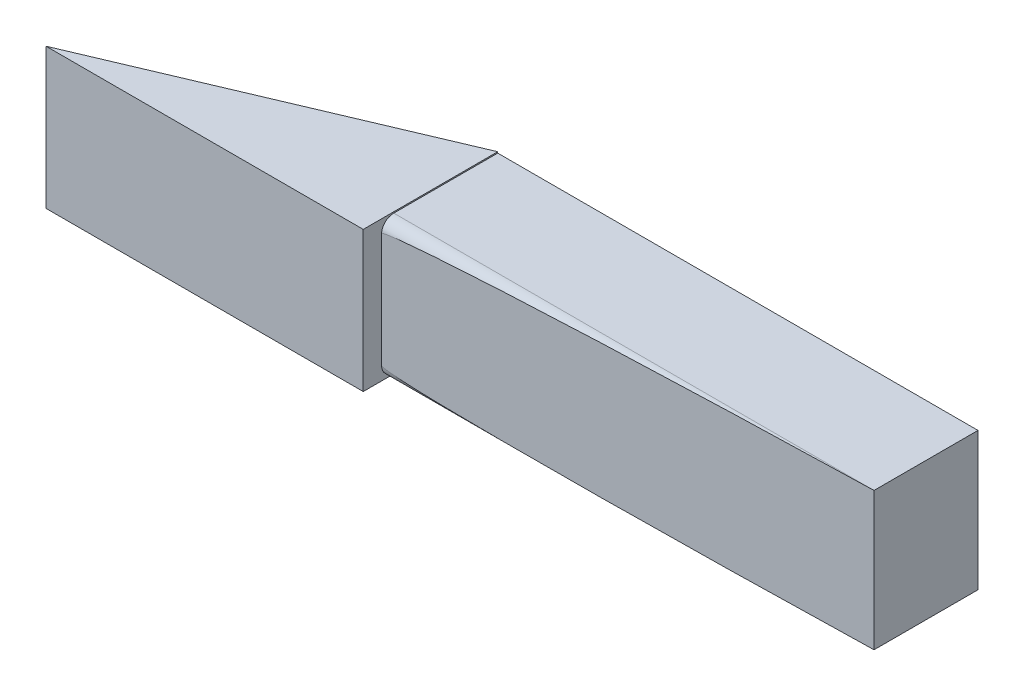
ISO-10303-21;
HEADER;
FILE_DESCRIPTION(('STEP AP214'),'2;1');
FILE_NAME('part.step','',(''),(''),'','','');
FILE_SCHEMA(('AUTOMOTIVE_DESIGN { 1 0 10303 214 1 1 1 1 }'));
ENDSEC;
DATA;
#1=APPLICATION_CONTEXT('core data for automotive mechanical design processes');
#2=APPLICATION_PROTOCOL_DEFINITION('international standard','automotive_design',2000,#1);
#3=PRODUCT_CONTEXT('',#1,'mechanical');
#4=PRODUCT('Part','Part','',(#3));
#5=PRODUCT_RELATED_PRODUCT_CATEGORY('part','',(#4));
#6=PRODUCT_DEFINITION_FORMATION('','',#4);
#7=PRODUCT_DEFINITION_CONTEXT('part definition',#1,'design');
#8=PRODUCT_DEFINITION('design','',#6,#7);
#9=PRODUCT_DEFINITION_SHAPE('','',#8);
#10=(LENGTH_UNIT() NAMED_UNIT(*) SI_UNIT(.MILLI.,.METRE.));
#11=(NAMED_UNIT(*) PLANE_ANGLE_UNIT() SI_UNIT($,.RADIAN.));
#12=(NAMED_UNIT(*) SI_UNIT($,.STERADIAN.) SOLID_ANGLE_UNIT());
#13=UNCERTAINTY_MEASURE_WITH_UNIT(LENGTH_MEASURE(1.E-05),#10,'distance_accuracy_value','');
#14=(GEOMETRIC_REPRESENTATION_CONTEXT(3) GLOBAL_UNCERTAINTY_ASSIGNED_CONTEXT((#13)) GLOBAL_UNIT_ASSIGNED_CONTEXT((#10,
#11,#12)) REPRESENTATION_CONTEXT('',''));
#15=CARTESIAN_POINT('',(0.,0.,0.));
#16=DIRECTION('',(0.,0.,1.));
#17=DIRECTION('',(1.,0.,0.));
#18=AXIS2_PLACEMENT_3D('',#15,#16,#17);
#19=CARTESIAN_POINT('',(-157.293506651165,-23.,114.887808394791));
#20=DIRECTION('',(0.,0.,-1.));
#21=DIRECTION('',(-1.,0.,0.));
#22=AXIS2_PLACEMENT_3D('',#19,#20,#21);
#23=PLANE('',#22);
#24=DIRECTION('',(0.,1.,0.));
#25=VECTOR('',#24,1.);
#26=CARTESIAN_POINT('',(-78.6662981451881,-23.,114.887808394791));
#27=LINE('',#26,#25);
#28=CARTESIAN_POINT('',(-78.6662981451881,-22.8,114.887808394791));
#29=VERTEX_POINT('',#28);
#30=CARTESIAN_POINT('',(-78.6662981451881,-0.2,114.887808394791));
#31=VERTEX_POINT('',#30);
#32=EDGE_CURVE('E141',#29,#31,#27,.T.);
#33=ORIENTED_EDGE('',*,*,#32,.F.);
#34=DIRECTION('',(-1.,0.,0.));
#35=VECTOR('',#34,1.);
#36=CARTESIAN_POINT('',(-157.293506651165,-22.8,114.887808394791));
#37=LINE('',#36,#35);
#38=CARTESIAN_POINT('',(-157.293506651165,-22.8,114.887808394791));
#39=VERTEX_POINT('',#38);
#40=EDGE_CURVE('E179',#29,#39,#37,.T.);
#41=ORIENTED_EDGE('',*,*,#40,.T.);
#42=DIRECTION('',(0.,1.,0.));
#43=VECTOR('',#42,1.);
#44=CARTESIAN_POINT('',(-157.293506651165,-23.,114.887808394791));
#45=LINE('',#44,#43);
#46=CARTESIAN_POINT('',(-157.293506651165,-0.2,114.887808394791));
#47=VERTEX_POINT('',#46);
#48=EDGE_CURVE('E140',#39,#47,#45,.T.);
#49=ORIENTED_EDGE('',*,*,#48,.T.);
#50=DIRECTION('',(1.,0.,0.));
#51=VECTOR('',#50,1.);
#52=CARTESIAN_POINT('',(-157.293506651165,-0.199999999999999,114.887808394791));
#53=LINE('',#52,#51);
#54=EDGE_CURVE('E371',#47,#31,#53,.T.);
#55=ORIENTED_EDGE('',*,*,#54,.T.);
#56=EDGE_LOOP('',(#33,#41,#49,#55));
#57=FACE_BOUND('',#56,.T.);
#58=ADVANCED_FACE('F71',(#57),#23,.T.);
#59=CARTESIAN_POINT('',(-78.6662981451881,-23.,114.887808394791));
#60=DIRECTION('',(1.,0.,0.));
#61=DIRECTION('',(0.,0.,-1.));
#62=AXIS2_PLACEMENT_3D('',#59,#60,#61);
#63=PLANE('',#62);
#64=DIRECTION('',(0.,1.,0.));
#65=VECTOR('',#64,1.);
#66=CARTESIAN_POINT('',(-78.6662981451881,-23.,131.906813660593));
#67=LINE('',#66,#65);
#68=CARTESIAN_POINT('',(-78.6662981451881,-22.8,131.906813660593));
#69=VERTEX_POINT('',#68);
#70=CARTESIAN_POINT('',(-78.6662981451881,-0.2,131.906813660593));
#71=VERTEX_POINT('',#70);
#72=EDGE_CURVE('E144',#69,#71,#67,.T.);
#73=ORIENTED_EDGE('',*,*,#72,.F.);
#74=DIRECTION('',(0.,0.,-1.));
#75=VECTOR('',#74,1.);
#76=CARTESIAN_POINT('',(-78.6662981451881,-22.8,131.906813660593));
#77=LINE('',#76,#75);
#78=EDGE_CURVE('E352',#69,#29,#77,.T.);
#79=ORIENTED_EDGE('',*,*,#78,.T.);
#80=ORIENTED_EDGE('',*,*,#32,.T.);
#81=DIRECTION('',(0.,0.,1.));
#82=VECTOR('',#81,1.);
#83=CARTESIAN_POINT('',(-78.6662981451881,-0.2,114.246438840142));
#84=LINE('',#83,#82);
#85=EDGE_CURVE('E362',#31,#71,#84,.T.);
#86=ORIENTED_EDGE('',*,*,#85,.T.);
#87=EDGE_LOOP('',(#73,#79,#80,#86));
#88=FACE_BOUND('',#87,.T.);
#89=ADVANCED_FACE('F207',(#88),#63,.T.);
#90=CARTESIAN_POINT('',(-78.6662981451881,-23.,131.906813660593));
#91=DIRECTION('',(0.0254282625175202,0.,0.999676649454882));
#92=DIRECTION('',(0.999676649454883,0.,-0.0254282625175202));
#93=AXIS2_PLACEMENT_3D('',#90,#91,#92);
#94=PLANE('',#93);
#95=DIRECTION('',(0.,1.,0.));
#96=VECTOR('',#95,1.);
#97=CARTESIAN_POINT('',(-157.293506651165,-23.,133.906813660593));
#98=LINE('',#97,#96);
#99=CARTESIAN_POINT('',(-157.293506651165,-20.8,133.906813660593));
#100=VERTEX_POINT('',#99);
#101=CARTESIAN_POINT('',(-157.293506651165,-2.00000000000003,133.906813660593));
#102=VERTEX_POINT('',#101);
#103=EDGE_CURVE('E147',#100,#102,#98,.T.);
#104=ORIENTED_EDGE('',*,*,#103,.F.);
#105=CARTESIAN_POINT('',(-78.6662981451881,-20.8,131.906813660593));
#106=DIRECTION('',(0.0254282625175202,0.,0.999676649454882));
#107=DIRECTION('',(0.999676649454883,0.,-0.0254282625175202));
#108=AXIS2_PLACEMENT_3D('',#105,#106,#107);
#109=ELLIPSE('',#108,78.6526408802802,2.);
#110=EDGE_CURVE('E366',#100,#69,#109,.T.);
#111=ORIENTED_EDGE('',*,*,#110,.T.);
#112=ORIENTED_EDGE('',*,*,#72,.T.);
#113=CARTESIAN_POINT('',(-79.0603227524528,-2.19997488670479,131.916836262559));
#114=DIRECTION('',(0.0254282625175202,0.,0.999676649454882));
#115=DIRECTION('',(0.999676649454883,0.,-0.0254282625175202));
#116=AXIS2_PLACEMENT_3D('',#113,#114,#115);
#117=ELLIPSE('',#116,78.6526408802799,2.);
#118=EDGE_CURVE('E372',#71,#102,#117,.T.);
#119=ORIENTED_EDGE('',*,*,#118,.T.);
#120=EDGE_LOOP('',(#104,#111,#112,#119));
#121=FACE_BOUND('',#120,.T.);
#122=ADVANCED_FACE('F200',(#121),#94,.T.);
#123=CARTESIAN_POINT('',(0.,-23.,0.));
#124=DIRECTION('',(0.,1.,0.));
#125=DIRECTION('',(0.,0.,1.));
#126=AXIS2_PLACEMENT_3D('',#123,#124,#125);
#127=PLANE('',#126);
#128=DIRECTION('',(-0.920684027694815,0.,0.390308751051848));
#129=VECTOR('',#128,1.);
#130=CARTESIAN_POINT('',(-209.233275870581,-23.,136.906813660593));
#131=LINE('',#130,#129);
#132=CARTESIAN_POINT('',(-157.293506651165,-23.,114.887808394791));
#133=VERTEX_POINT('',#132);
#134=CARTESIAN_POINT('',(-209.233275870581,-23.,136.906813660593));
#135=VERTEX_POINT('',#134);
#136=EDGE_CURVE('E118',#133,#135,#131,.T.);
#137=ORIENTED_EDGE('',*,*,#136,.F.);
#138=DIRECTION('',(0.,0.,-1.));
#139=VECTOR('',#138,1.);
#140=CARTESIAN_POINT('',(-157.293506651165,-23.,133.906813660593));
#141=LINE('',#140,#139);
#142=CARTESIAN_POINT('',(-157.293506651165,-23.,136.906813660593));
#143=VERTEX_POINT('',#142);
#144=EDGE_CURVE('E134',#143,#133,#141,.T.);
#145=ORIENTED_EDGE('',*,*,#144,.F.);
#146=DIRECTION('',(1.,0.,0.));
#147=VECTOR('',#146,1.);
#148=CARTESIAN_POINT('',(-157.293506651165,-23.,136.906813660593));
#149=LINE('',#148,#147);
#150=EDGE_CURVE('E132',#135,#143,#149,.T.);
#151=ORIENTED_EDGE('',*,*,#150,.F.);
#152=EDGE_LOOP('',(#137,#145,#151));
#153=FACE_BOUND('',#152,.T.);
#154=ADVANCED_FACE('F198',(#153),#127,.F.);
#155=CARTESIAN_POINT('',(0.,0.,0.));
#156=DIRECTION('',(0.,1.,0.));
#157=DIRECTION('',(0.,0.,1.));
#158=AXIS2_PLACEMENT_3D('',#155,#156,#157);
#159=PLANE('',#158);
#160=DIRECTION('',(0.,0.,-1.));
#161=VECTOR('',#160,1.);
#162=CARTESIAN_POINT('',(-157.293506651165,0.,133.906813660593));
#163=LINE('',#162,#161);
#164=CARTESIAN_POINT('',(-157.293506651165,0.,136.906813660593));
#165=VERTEX_POINT('',#164);
#166=CARTESIAN_POINT('',(-157.293506651165,0.,114.887808394791));
#167=VERTEX_POINT('',#166);
#168=EDGE_CURVE('E127',#165,#167,#163,.T.);
#169=ORIENTED_EDGE('',*,*,#168,.T.);
#170=DIRECTION('',(-0.920684027694815,0.,0.390308751051848));
#171=VECTOR('',#170,1.);
#172=CARTESIAN_POINT('',(-209.233275870581,0.,136.906813660593));
#173=LINE('',#172,#171);
#174=CARTESIAN_POINT('',(-209.233275870581,0.,136.906813660593));
#175=VERTEX_POINT('',#174);
#176=EDGE_CURVE('E115',#167,#175,#173,.T.);
#177=ORIENTED_EDGE('',*,*,#176,.T.);
#178=DIRECTION('',(1.,0.,0.));
#179=VECTOR('',#178,1.);
#180=CARTESIAN_POINT('',(-157.293506651165,0.,136.906813660593));
#181=LINE('',#180,#179);
#182=EDGE_CURVE('E123',#175,#165,#181,.T.);
#183=ORIENTED_EDGE('',*,*,#182,.T.);
#184=EDGE_LOOP('',(#169,#177,#183));
#185=FACE_BOUND('',#184,.T.);
#186=ADVANCED_FACE('F130',(#185),#159,.T.);
#187=CARTESIAN_POINT('',(-209.233275870581,-23.,136.906813660593));
#188=DIRECTION('',(-0.390308751051848,0.,-0.920684027694815));
#189=DIRECTION('',(-0.920684027694815,0.,0.390308751051848));
#190=AXIS2_PLACEMENT_3D('',#187,#188,#189);
#191=PLANE('',#190);
#192=ORIENTED_EDGE('',*,*,#176,.F.);
#193=DIRECTION('',(0.,-1.,0.));
#194=VECTOR('',#193,1.);
#195=CARTESIAN_POINT('',(-157.293506651165,-23.,114.887808394791));
#196=LINE('',#195,#194);
#197=EDGE_CURVE('E389',#167,#47,#196,.T.);
#198=ORIENTED_EDGE('',*,*,#197,.T.);
#199=ORIENTED_EDGE('',*,*,#48,.F.);
#200=EDGE_CURVE('E120',#133,#39,#45,.T.);
#201=ORIENTED_EDGE('',*,*,#200,.F.);
#202=ORIENTED_EDGE('',*,*,#136,.T.);
#203=DIRECTION('',(0.,1.,0.));
#204=VECTOR('',#203,1.);
#205=CARTESIAN_POINT('',(-209.233275870581,-23.,136.906813660593));
#206=LINE('',#205,#204);
#207=EDGE_CURVE('E95',#135,#175,#206,.T.);
#208=ORIENTED_EDGE('',*,*,#207,.T.);
#209=EDGE_LOOP('',(#192,#198,#199,#201,#202,#208));
#210=FACE_BOUND('',#209,.T.);
#211=DIRECTION('',(-0.920684027694815,0.,0.390308751051848));
#212=VECTOR('',#211,1.);
#213=CARTESIAN_POINT('',(-209.233275870581,-3.,136.906813660593));
#214=LINE('',#213,#212);
#215=CARTESIAN_POINT('',(-161.293506651165,-3.,116.583542172335));
#216=VERTEX_POINT('',#215);
#217=CARTESIAN_POINT('',(-202.156693355736,-3.,133.906813660593));
#218=VERTEX_POINT('',#217);
#219=EDGE_CURVE('E152',#216,#218,#214,.T.);
#220=ORIENTED_EDGE('',*,*,#219,.T.);
#221=DIRECTION('',(0.,-1.,0.));
#222=VECTOR('',#221,1.);
#223=CARTESIAN_POINT('',(-202.156693355736,-23.,133.906813660593));
#224=LINE('',#223,#222);
#225=CARTESIAN_POINT('',(-202.156693355736,-20.,133.906813660593));
#226=VERTEX_POINT('',#225);
#227=EDGE_CURVE('E13',#218,#226,#224,.T.);
#228=ORIENTED_EDGE('',*,*,#227,.T.);
#229=DIRECTION('',(0.920684027694815,0.,-0.390308751051848));
#230=VECTOR('',#229,1.);
#231=CARTESIAN_POINT('',(-209.233275870581,-20.,136.906813660593));
#232=LINE('',#231,#230);
#233=CARTESIAN_POINT('',(-161.293506651165,-20.,116.583542172335));
#234=VERTEX_POINT('',#233);
#235=EDGE_CURVE('E79',#226,#234,#232,.T.);
#236=ORIENTED_EDGE('',*,*,#235,.T.);
#237=DIRECTION('',(0.,-1.,0.));
#238=VECTOR('',#237,1.);
#239=CARTESIAN_POINT('',(-161.293506651165,-23.,116.583542172335));
#240=LINE('',#239,#238);
#241=EDGE_CURVE('E119',#216,#234,#240,.T.);
#242=ORIENTED_EDGE('',*,*,#241,.F.);
#243=EDGE_LOOP('',(#220,#228,#236,#242));
#244=FACE_BOUND('',#243,.T.);
#245=ADVANCED_FACE('F111',(#210,#244),#191,.T.);
#246=CARTESIAN_POINT('',(-157.293506651165,-23.,136.906813660593));
#247=DIRECTION('',(0.,0.,1.));
#248=DIRECTION('',(1.,0.,0.));
#249=AXIS2_PLACEMENT_3D('',#246,#247,#248);
#250=PLANE('',#249);
#251=ORIENTED_EDGE('',*,*,#182,.F.);
#252=ORIENTED_EDGE('',*,*,#207,.F.);
#253=ORIENTED_EDGE('',*,*,#150,.T.);
#254=DIRECTION('',(0.,1.,0.));
#255=VECTOR('',#254,1.);
#256=CARTESIAN_POINT('',(-157.293506651165,-23.,136.906813660593));
#257=LINE('',#256,#255);
#258=EDGE_CURVE('E124',#143,#165,#257,.T.);
#259=ORIENTED_EDGE('',*,*,#258,.T.);
#260=EDGE_LOOP('',(#251,#252,#253,#259));
#261=FACE_BOUND('',#260,.T.);
#262=ADVANCED_FACE('F73',(#261),#250,.T.);
#263=CARTESIAN_POINT('',(-157.293506651165,-23.,133.906813660593));
#264=DIRECTION('',(1.,0.,0.));
#265=DIRECTION('',(0.,0.,-1.));
#266=AXIS2_PLACEMENT_3D('',#263,#264,#265);
#267=PLANE('',#266);
#268=ORIENTED_EDGE('',*,*,#144,.T.);
#269=ORIENTED_EDGE('',*,*,#200,.T.);
#270=DIRECTION('',(0.,0.,1.));
#271=VECTOR('',#270,1.);
#272=CARTESIAN_POINT('',(-157.293506651165,-22.8,131.906813660593));
#273=LINE('',#272,#271);
#274=CARTESIAN_POINT('',(-157.293506651165,-22.8,131.906813660593));
#275=VERTEX_POINT('',#274);
#276=EDGE_CURVE('E413',#39,#275,#273,.T.);
#277=ORIENTED_EDGE('',*,*,#276,.T.);
#278=CARTESIAN_POINT('',(-157.293506651165,-20.8,131.906813660593));
#279=DIRECTION('',(1.,0.,0.));
#280=DIRECTION('',(0.,0.,-1.));
#281=AXIS2_PLACEMENT_3D('',#278,#279,#280);
#282=CIRCLE('',#281,2.);
#283=EDGE_CURVE('E391',#275,#100,#282,.F.);
#284=ORIENTED_EDGE('',*,*,#283,.T.);
#285=ORIENTED_EDGE('',*,*,#103,.T.);
#286=CARTESIAN_POINT('',(-157.293506651165,-2.19997488670479,131.916836262559));
#287=DIRECTION('',(1.,0.,0.));
#288=DIRECTION('',(0.,0.,-1.));
#289=AXIS2_PLACEMENT_3D('',#286,#287,#288);
#290=CIRCLE('',#289,2.);
#291=CARTESIAN_POINT('',(-157.293506651165,-0.2,131.906813660593));
#292=VERTEX_POINT('',#291);
#293=EDGE_CURVE('E387',#102,#292,#290,.F.);
#294=ORIENTED_EDGE('',*,*,#293,.T.);
#295=DIRECTION('',(0.,0.,-1.));
#296=VECTOR('',#295,1.);
#297=CARTESIAN_POINT('',(-157.293506651165,-0.2,114.246438840142));
#298=LINE('',#297,#296);
#299=EDGE_CURVE('E412',#292,#47,#298,.T.);
#300=ORIENTED_EDGE('',*,*,#299,.T.);
#301=ORIENTED_EDGE('',*,*,#197,.F.);
#302=ORIENTED_EDGE('',*,*,#168,.F.);
#303=ORIENTED_EDGE('',*,*,#258,.F.);
#304=EDGE_LOOP('',(#268,#269,#277,#284,#285,#294,#300,#301,#302,#303));
#305=FACE_BOUND('',#304,.T.);
#306=ADVANCED_FACE('F188',(#305),#267,.T.);
#307=CARTESIAN_POINT('',(-131.78424242617,-20.,133.906813660593));
#308=DIRECTION('',(0.,0.,-1.));
#309=DIRECTION('',(-1.,0.,0.));
#310=AXIS2_PLACEMENT_3D('',#307,#308,#309);
#311=PLANE('',#310);
#312=DIRECTION('',(-1.,0.,0.));
#313=VECTOR('',#312,1.);
#314=CARTESIAN_POINT('',(-131.78424242617,-3.,133.906813660593));
#315=LINE('',#314,#313);
#316=CARTESIAN_POINT('',(-161.293506651165,-3.,133.906813660593));
#317=VERTEX_POINT('',#316);
#318=EDGE_CURVE('E176',#317,#218,#315,.T.);
#319=ORIENTED_EDGE('',*,*,#318,.F.);
#320=DIRECTION('',(0.,-1.,0.));
#321=VECTOR('',#320,1.);
#322=CARTESIAN_POINT('',(-161.293506651165,-20.,133.906813660593));
#323=LINE('',#322,#321);
#324=CARTESIAN_POINT('',(-161.293506651165,-20.,133.906813660593));
#325=VERTEX_POINT('',#324);
#326=EDGE_CURVE('E175',#317,#325,#323,.T.);
#327=ORIENTED_EDGE('',*,*,#326,.T.);
#328=DIRECTION('',(-1.,0.,0.));
#329=VECTOR('',#328,1.);
#330=CARTESIAN_POINT('',(-131.78424242617,-20.,133.906813660593));
#331=LINE('',#330,#329);
#332=EDGE_CURVE('E168',#325,#226,#331,.T.);
#333=ORIENTED_EDGE('',*,*,#332,.T.);
#334=ORIENTED_EDGE('',*,*,#227,.F.);
#335=EDGE_LOOP('',(#319,#327,#333,#334));
#336=FACE_BOUND('',#335,.T.);
#337=ADVANCED_FACE('F173',(#336),#311,.T.);
#338=CARTESIAN_POINT('',(-131.78424242617,-20.,117.887808394791));
#339=DIRECTION('',(0.,1.,0.));
#340=DIRECTION('',(0.,0.,1.));
#341=AXIS2_PLACEMENT_3D('',#338,#339,#340);
#342=PLANE('',#341);
#343=ORIENTED_EDGE('',*,*,#332,.F.);
#344=DIRECTION('',(0.,0.,-1.));
#345=VECTOR('',#344,1.);
#346=CARTESIAN_POINT('',(-161.293506651165,-20.,117.887808394791));
#347=LINE('',#346,#345);
#348=EDGE_CURVE('E128',#325,#234,#347,.T.);
#349=ORIENTED_EDGE('',*,*,#348,.T.);
#350=ORIENTED_EDGE('',*,*,#235,.F.);
#351=EDGE_LOOP('',(#343,#349,#350));
#352=FACE_BOUND('',#351,.T.);
#353=ADVANCED_FACE('F166',(#352),#342,.T.);
#354=CARTESIAN_POINT('',(-131.78424242617,-3.,133.906813660593));
#355=DIRECTION('',(0.,-1.,0.));
#356=DIRECTION('',(0.,0.,-1.));
#357=AXIS2_PLACEMENT_3D('',#354,#355,#356);
#358=PLANE('',#357);
#359=DIRECTION('',(0.,0.,1.));
#360=VECTOR('',#359,1.);
#361=CARTESIAN_POINT('',(-161.293506651165,-3.,133.906813660593));
#362=LINE('',#361,#360);
#363=EDGE_CURVE('E86',#216,#317,#362,.T.);
#364=ORIENTED_EDGE('',*,*,#363,.T.);
#365=ORIENTED_EDGE('',*,*,#318,.T.);
#366=ORIENTED_EDGE('',*,*,#219,.F.);
#367=EDGE_LOOP('',(#364,#365,#366));
#368=FACE_BOUND('',#367,.T.);
#369=ADVANCED_FACE('F268',(#368),#358,.T.);
#370=CARTESIAN_POINT('',(-161.293506651165,-23.,133.906813660593));
#371=DIRECTION('',(1.,0.,0.));
#372=DIRECTION('',(0.,0.,-1.));
#373=AXIS2_PLACEMENT_3D('',#370,#371,#372);
#374=PLANE('',#373);
#375=ORIENTED_EDGE('',*,*,#241,.T.);
#376=ORIENTED_EDGE('',*,*,#348,.F.);
#377=ORIENTED_EDGE('',*,*,#326,.F.);
#378=ORIENTED_EDGE('',*,*,#363,.F.);
#379=EDGE_LOOP('',(#375,#376,#377,#378));
#380=FACE_BOUND('',#379,.T.);
#381=ADVANCED_FACE('F263',(#380),#374,.F.);
#382=CARTESIAN_POINT('',(-190.070527152381,-2.19997488670479,131.916836262559));
#383=DIRECTION('',(1.,0.,0.));
#384=DIRECTION('',(0.,0.,-1.));
#385=AXIS2_PLACEMENT_3D('',#382,#383,#384);
#386=CYLINDRICAL_SURFACE('',#385,2.);
#387=DIRECTION('',(1.,0.,0.));
#388=VECTOR('',#387,1.);
#389=CARTESIAN_POINT('',(-190.070527152381,-0.2,131.906813660593));
#390=LINE('',#389,#388);
#391=EDGE_CURVE('E383',#292,#71,#390,.T.);
#392=ORIENTED_EDGE('',*,*,#391,.F.);
#393=ORIENTED_EDGE('',*,*,#293,.F.);
#394=ORIENTED_EDGE('',*,*,#118,.F.);
#395=EDGE_LOOP('',(#392,#393,#394));
#396=FACE_BOUND('',#395,.T.);
#397=ADVANCED_FACE('F267',(#396),#386,.T.);
#398=CARTESIAN_POINT('',(-190.070527152381,-0.2,114.246438840142));
#399=DIRECTION('',(0.,1.,0.));
#400=DIRECTION('',(0.,0.,1.));
#401=AXIS2_PLACEMENT_3D('',#398,#399,#400);
#402=PLANE('',#401);
#403=ORIENTED_EDGE('',*,*,#299,.F.);
#404=ORIENTED_EDGE('',*,*,#391,.T.);
#405=ORIENTED_EDGE('',*,*,#85,.F.);
#406=ORIENTED_EDGE('',*,*,#54,.F.);
#407=EDGE_LOOP('',(#403,#404,#405,#406));
#408=FACE_BOUND('',#407,.T.);
#409=ADVANCED_FACE('F314',(#408),#402,.T.);
#410=CARTESIAN_POINT('',(-190.070527152381,-20.8,131.906813660593));
#411=DIRECTION('',(1.,0.,0.));
#412=DIRECTION('',(0.,0.,-1.));
#413=AXIS2_PLACEMENT_3D('',#410,#411,#412);
#414=CYLINDRICAL_SURFACE('',#413,2.);
#415=ORIENTED_EDGE('',*,*,#283,.F.);
#416=DIRECTION('',(1.,0.,0.));
#417=VECTOR('',#416,1.);
#418=CARTESIAN_POINT('',(-190.070527152381,-22.8,131.906813660593));
#419=LINE('',#418,#417);
#420=EDGE_CURVE('E356',#275,#69,#419,.T.);
#421=ORIENTED_EDGE('',*,*,#420,.T.);
#422=ORIENTED_EDGE('',*,*,#110,.F.);
#423=EDGE_LOOP('',(#415,#421,#422));
#424=FACE_BOUND('',#423,.T.);
#425=ADVANCED_FACE('F323',(#424),#414,.T.);
#426=CARTESIAN_POINT('',(-190.070527152381,-22.8,131.906813660593));
#427=DIRECTION('',(0.,-1.,0.));
#428=DIRECTION('',(0.,0.,-1.));
#429=AXIS2_PLACEMENT_3D('',#426,#427,#428);
#430=PLANE('',#429);
#431=ORIENTED_EDGE('',*,*,#78,.F.);
#432=ORIENTED_EDGE('',*,*,#420,.F.);
#433=ORIENTED_EDGE('',*,*,#276,.F.);
#434=ORIENTED_EDGE('',*,*,#40,.F.);
#435=EDGE_LOOP('',(#431,#432,#433,#434));
#436=FACE_BOUND('',#435,.T.);
#437=ADVANCED_FACE('F332',(#436),#430,.T.);
#438=CLOSED_SHELL('',(#58,#89,#122,#154,#186,#245,#262,#306,#337,#353,#369,#381,#397,#409,#425,#437));
#439=MANIFOLD_SOLID_BREP('B2',#438);
#440=ADVANCED_BREP_SHAPE_REPRESENTATION('',(#18,#439),#14);
#441=SHAPE_DEFINITION_REPRESENTATION(#9,#440);
ENDSEC;
END-ISO-10303-21;
